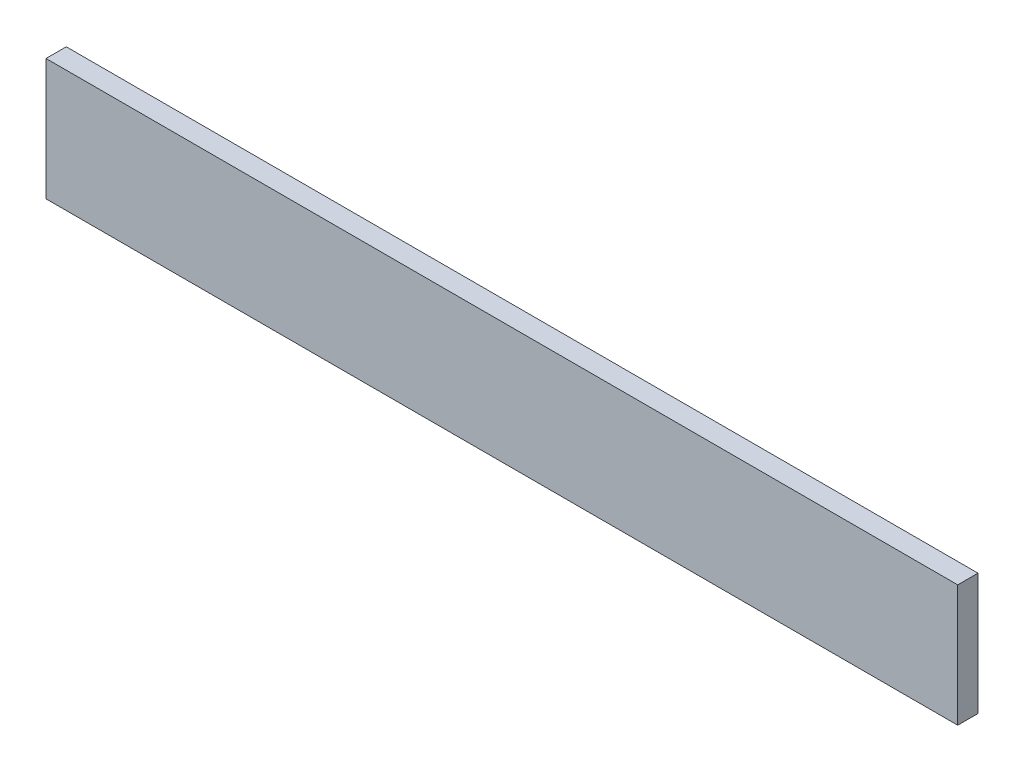
ISO-10303-21;
HEADER;
FILE_DESCRIPTION(('STEP AP214'),'2;1');
FILE_NAME('part.step','',(''),(''),'','','');
FILE_SCHEMA(('AUTOMOTIVE_DESIGN { 1 0 10303 214 1 1 1 1 }'));
ENDSEC;
DATA;
#1=APPLICATION_CONTEXT('core data for automotive mechanical design processes');
#2=APPLICATION_PROTOCOL_DEFINITION('international standard','automotive_design',2000,#1);
#3=PRODUCT_CONTEXT('',#1,'mechanical');
#4=PRODUCT('Part','Part','',(#3));
#5=PRODUCT_RELATED_PRODUCT_CATEGORY('part','',(#4));
#6=PRODUCT_DEFINITION_FORMATION('','',#4);
#7=PRODUCT_DEFINITION_CONTEXT('part definition',#1,'design');
#8=PRODUCT_DEFINITION('design','',#6,#7);
#9=PRODUCT_DEFINITION_SHAPE('','',#8);
#10=(LENGTH_UNIT() NAMED_UNIT(*) SI_UNIT(.MILLI.,.METRE.));
#11=(NAMED_UNIT(*) PLANE_ANGLE_UNIT() SI_UNIT($,.RADIAN.));
#12=(NAMED_UNIT(*) SI_UNIT($,.STERADIAN.) SOLID_ANGLE_UNIT());
#13=UNCERTAINTY_MEASURE_WITH_UNIT(LENGTH_MEASURE(1.E-05),#10,'distance_accuracy_value','');
#14=(GEOMETRIC_REPRESENTATION_CONTEXT(3) GLOBAL_UNCERTAINTY_ASSIGNED_CONTEXT((#13)) GLOBAL_UNIT_ASSIGNED_CONTEXT((#10,
#11,#12)) REPRESENTATION_CONTEXT('',''));
#15=CARTESIAN_POINT('',(0.,0.,0.));
#16=DIRECTION('',(0.,0.,1.));
#17=DIRECTION('',(1.,0.,0.));
#18=AXIS2_PLACEMENT_3D('',#15,#16,#17);
#19=CARTESIAN_POINT('',(112.5,15.,5.));
#20=DIRECTION('',(-1.,0.,0.));
#21=DIRECTION('',(0.,-1.,0.));
#22=AXIS2_PLACEMENT_3D('',#19,#20,#21);
#23=PLANE('',#22);
#24=DIRECTION('',(0.,1.,0.));
#25=VECTOR('',#24,1.);
#26=CARTESIAN_POINT('',(112.5,15.,0.));
#27=LINE('',#26,#25);
#28=CARTESIAN_POINT('',(112.5,-15.,0.));
#29=VERTEX_POINT('',#28);
#30=CARTESIAN_POINT('',(112.5,15.,0.));
#31=VERTEX_POINT('',#30);
#32=EDGE_CURVE('E100',#29,#31,#27,.T.);
#33=ORIENTED_EDGE('',*,*,#32,.T.);
#34=DIRECTION('',(0.,0.,-1.));
#35=VECTOR('',#34,1.);
#36=CARTESIAN_POINT('',(112.5,15.,5.));
#37=LINE('',#36,#35);
#38=CARTESIAN_POINT('',(112.5,15.,5.));
#39=VERTEX_POINT('',#38);
#40=EDGE_CURVE('E11',#39,#31,#37,.T.);
#41=ORIENTED_EDGE('',*,*,#40,.F.);
#42=DIRECTION('',(0.,1.,0.));
#43=VECTOR('',#42,1.);
#44=CARTESIAN_POINT('',(112.5,15.,5.));
#45=LINE('',#44,#43);
#46=CARTESIAN_POINT('',(112.5,-15.,5.));
#47=VERTEX_POINT('',#46);
#48=EDGE_CURVE('E88',#47,#39,#45,.T.);
#49=ORIENTED_EDGE('',*,*,#48,.F.);
#50=DIRECTION('',(0.,0.,-1.));
#51=VECTOR('',#50,1.);
#52=CARTESIAN_POINT('',(112.5,-15.,5.));
#53=LINE('',#52,#51);
#54=EDGE_CURVE('E96',#47,#29,#53,.T.);
#55=ORIENTED_EDGE('',*,*,#54,.T.);
#56=EDGE_LOOP('',(#33,#41,#49,#55));
#57=FACE_BOUND('',#56,.T.);
#58=ADVANCED_FACE('F37',(#57),#23,.F.);
#59=CARTESIAN_POINT('',(-112.5,15.,5.));
#60=DIRECTION('',(0.,-1.,0.));
#61=DIRECTION('',(0.,0.,-1.));
#62=AXIS2_PLACEMENT_3D('',#59,#60,#61);
#63=PLANE('',#62);
#64=DIRECTION('',(-1.,0.,0.));
#65=VECTOR('',#64,1.);
#66=CARTESIAN_POINT('',(-112.5,15.,0.));
#67=LINE('',#66,#65);
#68=CARTESIAN_POINT('',(-112.5,15.,0.));
#69=VERTEX_POINT('',#68);
#70=EDGE_CURVE('E92',#31,#69,#67,.T.);
#71=ORIENTED_EDGE('',*,*,#70,.T.);
#72=DIRECTION('',(0.,0.,-1.));
#73=VECTOR('',#72,1.);
#74=CARTESIAN_POINT('',(-112.5,15.,5.));
#75=LINE('',#74,#73);
#76=CARTESIAN_POINT('',(-112.5,15.,5.));
#77=VERTEX_POINT('',#76);
#78=EDGE_CURVE('E45',#77,#69,#75,.T.);
#79=ORIENTED_EDGE('',*,*,#78,.F.);
#80=DIRECTION('',(-1.,0.,0.));
#81=VECTOR('',#80,1.);
#82=CARTESIAN_POINT('',(-112.5,15.,5.));
#83=LINE('',#82,#81);
#84=EDGE_CURVE('E83',#39,#77,#83,.T.);
#85=ORIENTED_EDGE('',*,*,#84,.F.);
#86=ORIENTED_EDGE('',*,*,#40,.T.);
#87=EDGE_LOOP('',(#71,#79,#85,#86));
#88=FACE_BOUND('',#87,.T.);
#89=ADVANCED_FACE('F91',(#88),#63,.F.);
#90=CARTESIAN_POINT('',(-112.5,15.,5.));
#91=DIRECTION('',(1.,0.,0.));
#92=DIRECTION('',(0.,1.,0.));
#93=AXIS2_PLACEMENT_3D('',#90,#91,#92);
#94=PLANE('',#93);
#95=DIRECTION('',(0.,-1.,0.));
#96=VECTOR('',#95,1.);
#97=CARTESIAN_POINT('',(-112.5,15.,0.));
#98=LINE('',#97,#96);
#99=CARTESIAN_POINT('',(-112.5,-15.,0.));
#100=VERTEX_POINT('',#99);
#101=EDGE_CURVE('E70',#69,#100,#98,.T.);
#102=ORIENTED_EDGE('',*,*,#101,.T.);
#103=DIRECTION('',(0.,0.,-1.));
#104=VECTOR('',#103,1.);
#105=CARTESIAN_POINT('',(-112.5,-15.,5.));
#106=LINE('',#105,#104);
#107=CARTESIAN_POINT('',(-112.5,-15.,5.));
#108=VERTEX_POINT('',#107);
#109=EDGE_CURVE('E93',#108,#100,#106,.T.);
#110=ORIENTED_EDGE('',*,*,#109,.F.);
#111=DIRECTION('',(0.,-1.,0.));
#112=VECTOR('',#111,1.);
#113=CARTESIAN_POINT('',(-112.5,15.,5.));
#114=LINE('',#113,#112);
#115=EDGE_CURVE('E86',#77,#108,#114,.T.);
#116=ORIENTED_EDGE('',*,*,#115,.F.);
#117=ORIENTED_EDGE('',*,*,#78,.T.);
#118=EDGE_LOOP('',(#102,#110,#116,#117));
#119=FACE_BOUND('',#118,.T.);
#120=ADVANCED_FACE('F94',(#119),#94,.F.);
#121=CARTESIAN_POINT('',(-112.5,-15.,5.));
#122=DIRECTION('',(0.,1.,0.));
#123=DIRECTION('',(0.,0.,1.));
#124=AXIS2_PLACEMENT_3D('',#121,#122,#123);
#125=PLANE('',#124);
#126=DIRECTION('',(1.,0.,0.));
#127=VECTOR('',#126,1.);
#128=CARTESIAN_POINT('',(-112.5,-15.,0.));
#129=LINE('',#128,#127);
#130=EDGE_CURVE('E76',#100,#29,#129,.T.);
#131=ORIENTED_EDGE('',*,*,#130,.T.);
#132=ORIENTED_EDGE('',*,*,#54,.F.);
#133=DIRECTION('',(1.,0.,0.));
#134=VECTOR('',#133,1.);
#135=CARTESIAN_POINT('',(-112.5,-15.,5.));
#136=LINE('',#135,#134);
#137=EDGE_CURVE('E53',#108,#47,#136,.T.);
#138=ORIENTED_EDGE('',*,*,#137,.F.);
#139=ORIENTED_EDGE('',*,*,#109,.T.);
#140=EDGE_LOOP('',(#131,#132,#138,#139));
#141=FACE_BOUND('',#140,.T.);
#142=ADVANCED_FACE('F107',(#141),#125,.F.);
#143=CARTESIAN_POINT('',(0.,0.,5.));
#144=DIRECTION('',(0.,0.,1.));
#145=DIRECTION('',(1.,0.,0.));
#146=AXIS2_PLACEMENT_3D('',#143,#144,#145);
#147=PLANE('',#146);
#148=ORIENTED_EDGE('',*,*,#48,.T.);
#149=ORIENTED_EDGE('',*,*,#84,.T.);
#150=ORIENTED_EDGE('',*,*,#115,.T.);
#151=ORIENTED_EDGE('',*,*,#137,.T.);
#152=EDGE_LOOP('',(#148,#149,#150,#151));
#153=FACE_BOUND('',#152,.T.);
#154=ADVANCED_FACE('F84',(#153),#147,.T.);
#155=CARTESIAN_POINT('',(0.,0.,0.));
#156=DIRECTION('',(0.,0.,1.));
#157=DIRECTION('',(1.,0.,0.));
#158=AXIS2_PLACEMENT_3D('',#155,#156,#157);
#159=PLANE('',#158);
#160=ORIENTED_EDGE('',*,*,#32,.F.);
#161=ORIENTED_EDGE('',*,*,#130,.F.);
#162=ORIENTED_EDGE('',*,*,#101,.F.);
#163=ORIENTED_EDGE('',*,*,#70,.F.);
#164=EDGE_LOOP('',(#160,#161,#162,#163));
#165=FACE_BOUND('',#164,.T.);
#166=ADVANCED_FACE('F110',(#165),#159,.F.);
#167=CLOSED_SHELL('',(#58,#89,#120,#142,#154,#166));
#168=MANIFOLD_SOLID_BREP('B2',#167);
#169=ADVANCED_BREP_SHAPE_REPRESENTATION('',(#18,#168),#14);
#170=SHAPE_DEFINITION_REPRESENTATION(#9,#169);
ENDSEC;
END-ISO-10303-21;
